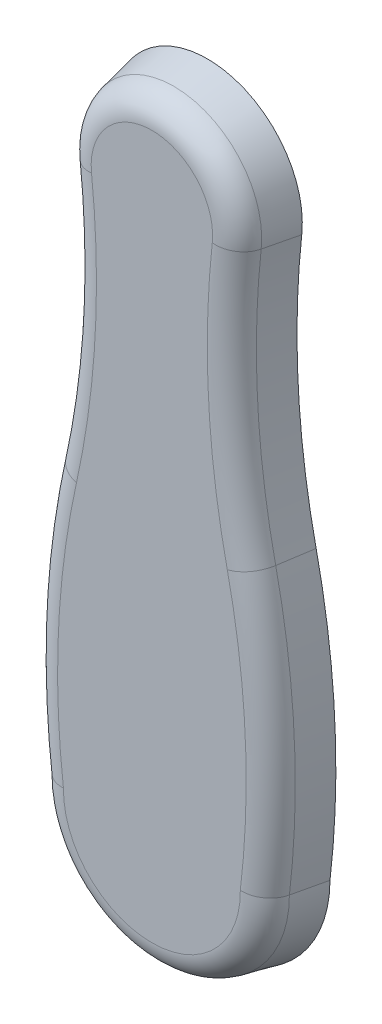
ISO-10303-21;
HEADER;
FILE_DESCRIPTION(('STEP AP214'),'2;1');
FILE_NAME('part.step','',(''),(''),'','','');
FILE_SCHEMA(('AUTOMOTIVE_DESIGN { 1 0 10303 214 1 1 1 1 }'));
ENDSEC;
DATA;
#1=APPLICATION_CONTEXT('core data for automotive mechanical design processes');
#2=APPLICATION_PROTOCOL_DEFINITION('international standard','automotive_design',2000,#1);
#3=PRODUCT_CONTEXT('',#1,'mechanical');
#4=PRODUCT('Part','Part','',(#3));
#5=PRODUCT_RELATED_PRODUCT_CATEGORY('part','',(#4));
#6=PRODUCT_DEFINITION_FORMATION('','',#4);
#7=PRODUCT_DEFINITION_CONTEXT('part definition',#1,'design');
#8=PRODUCT_DEFINITION('design','',#6,#7);
#9=PRODUCT_DEFINITION_SHAPE('','',#8);
#10=(LENGTH_UNIT() NAMED_UNIT(*) SI_UNIT(.MILLI.,.METRE.));
#11=(NAMED_UNIT(*) PLANE_ANGLE_UNIT() SI_UNIT($,.RADIAN.));
#12=(NAMED_UNIT(*) SI_UNIT($,.STERADIAN.) SOLID_ANGLE_UNIT());
#13=UNCERTAINTY_MEASURE_WITH_UNIT(LENGTH_MEASURE(1.E-05),#10,'distance_accuracy_value','');
#14=(GEOMETRIC_REPRESENTATION_CONTEXT(3) GLOBAL_UNCERTAINTY_ASSIGNED_CONTEXT((#13)) GLOBAL_UNIT_ASSIGNED_CONTEXT((#10,
#11,#12)) REPRESENTATION_CONTEXT('',''));
#15=CARTESIAN_POINT('',(0.,0.,0.));
#16=DIRECTION('',(0.,0.,1.));
#17=DIRECTION('',(1.,0.,0.));
#18=AXIS2_PLACEMENT_3D('',#15,#16,#17);
#19=CARTESIAN_POINT('',(-328.083559808091,164.486935028766,20.));
#20=DIRECTION('',(0.,0.,1.));
#21=DIRECTION('',(-1.,0.,0.));
#22=AXIS2_PLACEMENT_3D('',#19,#20,#21);
#23=CONICAL_SURFACE('',#22,300.,0.20943951023932);
#24=DIRECTION('',(-0.203051471258376,0.0446919589916192,-0.978147600733806));
#25=VECTOR('',#24,1.);
#26=CARTESIAN_POINT('',(-35.0964692894199,100.,20.));
#27=LINE('',#26,#25);
#28=CARTESIAN_POINT('',(-36.7407476828377,100.361908348036,12.0791169081776));
#29=VERTEX_POINT('',#28);
#30=CARTESIAN_POINT('',(-39.24822452771,100.913808078824,0.));
#31=VERTEX_POINT('',#30);
#32=EDGE_CURVE('E114',#29,#31,#27,.T.);
#33=ORIENTED_EDGE('',*,*,#32,.F.);
#34=CARTESIAN_POINT('',(-328.083559808091,164.486935028766,12.0791169081775));
#35=DIRECTION('',(0.,0.,-1.));
#36=DIRECTION('',(-1.,0.,0.));
#37=AXIS2_PLACEMENT_3D('',#34,#35,#36);
#38=CIRCLE('',#37,298.316364324612);
#39=CARTESIAN_POINT('',(-31.4996363031634,196.590354508288,12.0791169081776));
#40=VERTEX_POINT('',#39);
#41=EDGE_CURVE('E51',#29,#40,#38,.F.);
#42=ORIENTED_EDGE('',*,*,#41,.T.);
#43=DIRECTION('',(-0.206704265603666,-0.0223744890433036,-0.978147600733806));
#44=VECTOR('',#43,1.);
#45=CARTESIAN_POINT('',(-29.8257781643719,196.77153954807,20.));
#46=LINE('',#45,#44);
#47=CARTESIAN_POINT('',(-34.0522214015397,196.314052579303,0.));
#48=VERTEX_POINT('',#47);
#49=EDGE_CURVE('E140',#40,#48,#46,.T.);
#50=ORIENTED_EDGE('',*,*,#49,.T.);
#51=CARTESIAN_POINT('',(-328.083559808091,164.486935028766,0.));
#52=DIRECTION('',(0.,0.,-1.));
#53=DIRECTION('',(-1.,0.,0.));
#54=AXIS2_PLACEMENT_3D('',#51,#52,#53);
#55=CIRCLE('',#54,295.7488687666);
#56=EDGE_CURVE('E123',#48,#31,#55,.T.);
#57=ORIENTED_EDGE('',*,*,#56,.T.);
#58=EDGE_LOOP('',(#33,#42,#50,#57));
#59=FACE_BOUND('',#58,.T.);
#60=ADVANCED_FACE('F34',(#59),#23,.F.);
#61=CARTESIAN_POINT('',(257.890621229251,35.5130649712339,20.));
#62=DIRECTION('',(0.,0.,-1.));
#63=DIRECTION('',(1.,0.,0.));
#64=AXIS2_PLACEMENT_3D('',#61,#62,#63);
#65=CONICAL_SURFACE('',#64,300.,0.20943951023932);
#66=CARTESIAN_POINT('',(-40.,0.,20.));
#67=CARTESIAN_POINT('',(-40.708515301773,-0.0421104456059323,16.6666804994594));
#68=CARTESIAN_POINT('',(-41.4169712287903,-0.0846628276052535,13.3333540808833));
#69=CARTESIAN_POINT('',(-42.83376433192,-0.170651464306107,6.6666874142166));
#70=CARTESIAN_POINT('',(-43.5421015080326,-0.2140877190059,3.33334716612602));
#71=CARTESIAN_POINT('',(-44.2503793093897,-0.257965910097344,0.));
#72=B_SPLINE_CURVE_WITH_KNOTS('',3,(#66,#67,#68,#69,#70,#71),.UNSPECIFIED.,.F.,.F.,(4,2,4),(0.,
10.2241415124524,20.4482830047947),.UNSPECIFIED.);
#73=CARTESIAN_POINT('',(-41.6835135794539,-0.100889989374131,12.0791169081776));
#74=VERTEX_POINT('',#73);
#75=CARTESIAN_POINT('',(-44.2503793093897,-0.257965910096802,0.));
#76=VERTEX_POINT('',#75);
#77=EDGE_CURVE('E106',#74,#76,#72,.T.);
#78=ORIENTED_EDGE('',*,*,#77,.F.);
#79=CARTESIAN_POINT('',(257.890621229251,35.5130649712339,12.0791169081776));
#80=DIRECTION('',(0.,0.,1.));
#81=DIRECTION('',(1.,0.,0.));
#82=AXIS2_PLACEMENT_3D('',#79,#80,#81);
#83=CIRCLE('',#82,301.683635675388);
#84=EDGE_CURVE('E59',#74,#29,#83,.F.);
#85=ORIENTED_EDGE('',*,*,#84,.T.);
#86=ORIENTED_EDGE('',*,*,#32,.T.);
#87=CARTESIAN_POINT('',(257.890621229251,35.5130649712339,0.));
#88=DIRECTION('',(0.,0.,-1.));
#89=DIRECTION('',(-1.,0.,0.));
#90=AXIS2_PLACEMENT_3D('',#87,#88,#89);
#91=CIRCLE('',#90,304.251131233401);
#92=EDGE_CURVE('E118',#31,#76,#91,.F.);
#93=ORIENTED_EDGE('',*,*,#92,.T.);
#94=EDGE_LOOP('',(#78,#85,#86,#93));
#95=FACE_BOUND('',#94,.T.);
#96=ADVANCED_FACE('F119',(#95),#65,.T.);
#97=CARTESIAN_POINT('',(0.,0.,20.));
#98=DIRECTION('',(0.,0.,-1.));
#99=DIRECTION('',(1.,0.,0.));
#100=AXIS2_PLACEMENT_3D('',#97,#98,#99);
#101=CONICAL_SURFACE('',#100,40.,0.20943951023932);
#102=CARTESIAN_POINT('',(40.,0.,20.));
#103=CARTESIAN_POINT('',(40.7085153017731,-0.0421104456060641,16.6666804994594));
#104=CARTESIAN_POINT('',(41.4169712287903,-0.0846628276055089,13.3333540808833));
#105=CARTESIAN_POINT('',(42.83376433192,-0.17065146430651,6.66668741421661));
#106=CARTESIAN_POINT('',(43.5421015080326,-0.214087719006328,3.33334716612603));
#107=CARTESIAN_POINT('',(44.2503793093897,-0.257965910097746,0.));
#108=B_SPLINE_CURVE_WITH_KNOTS('',3,(#102,#103,#104,#105,#106,#107),.UNSPECIFIED.,.F.,.F.,(4,2,
4),(0.,10.2241415124524,20.4482830047947),.UNSPECIFIED.);
#109=CARTESIAN_POINT('',(41.683513579454,-0.100889989374964,12.0791169081776));
#110=VERTEX_POINT('',#109);
#111=CARTESIAN_POINT('',(44.2503793093897,-0.257965910097621,0.));
#112=VERTEX_POINT('',#111);
#113=EDGE_CURVE('E115',#110,#112,#108,.T.);
#114=ORIENTED_EDGE('',*,*,#113,.F.);
#115=CARTESIAN_POINT('',(0.,0.,12.0791169081776));
#116=DIRECTION('',(0.,0.,1.));
#117=DIRECTION('',(1.,0.,0.));
#118=AXIS2_PLACEMENT_3D('',#115,#116,#117);
#119=CIRCLE('',#118,41.683635675388);
#120=EDGE_CURVE('E43',#110,#74,#119,.F.);
#121=ORIENTED_EDGE('',*,*,#120,.T.);
#122=ORIENTED_EDGE('',*,*,#77,.T.);
#123=CARTESIAN_POINT('',(0.,0.,0.));
#124=DIRECTION('',(0.,0.,-1.));
#125=DIRECTION('',(-1.,0.,0.));
#126=AXIS2_PLACEMENT_3D('',#123,#124,#125);
#127=CIRCLE('',#126,44.2511312334004);
#128=EDGE_CURVE('E111',#76,#112,#127,.F.);
#129=ORIENTED_EDGE('',*,*,#128,.T.);
#130=EDGE_LOOP('',(#114,#121,#122,#129));
#131=FACE_BOUND('',#130,.T.);
#132=ADVANCED_FACE('F109',(#131),#101,.T.);
#133=CARTESIAN_POINT('',(-257.890621229251,35.513064971234,20.));
#134=DIRECTION('',(0.,0.,-1.));
#135=DIRECTION('',(-1.,0.,0.));
#136=AXIS2_PLACEMENT_3D('',#133,#134,#135);
#137=CONICAL_SURFACE('',#136,300.,0.20943951023932);
#138=DIRECTION('',(0.203051471258376,0.0446919589916192,-0.978147600733806));
#139=VECTOR('',#138,1.);
#140=CARTESIAN_POINT('',(35.0964692894198,100.,20.));
#141=LINE('',#140,#139);
#142=CARTESIAN_POINT('',(36.7407476828377,100.361908348036,12.0791169081776));
#143=VERTEX_POINT('',#142);
#144=CARTESIAN_POINT('',(39.24822452771,100.913808078824,0.));
#145=VERTEX_POINT('',#144);
#146=EDGE_CURVE('E133',#143,#145,#141,.T.);
#147=ORIENTED_EDGE('',*,*,#146,.F.);
#148=CARTESIAN_POINT('',(-257.890621229251,35.513064971234,12.0791169081777));
#149=DIRECTION('',(0.,0.,1.));
#150=DIRECTION('',(1.,0.,0.));
#151=AXIS2_PLACEMENT_3D('',#148,#149,#150);
#152=CIRCLE('',#151,301.683635675388);
#153=EDGE_CURVE('E156',#143,#110,#152,.F.);
#154=ORIENTED_EDGE('',*,*,#153,.T.);
#155=ORIENTED_EDGE('',*,*,#113,.T.);
#156=CARTESIAN_POINT('',(-257.890621229251,35.513064971234,0.));
#157=DIRECTION('',(0.,0.,-1.));
#158=DIRECTION('',(-1.,0.,0.));
#159=AXIS2_PLACEMENT_3D('',#156,#157,#158);
#160=CIRCLE('',#159,304.2511312334);
#161=EDGE_CURVE('E128',#112,#145,#160,.F.);
#162=ORIENTED_EDGE('',*,*,#161,.T.);
#163=EDGE_LOOP('',(#147,#154,#155,#162));
#164=FACE_BOUND('',#163,.T.);
#165=ADVANCED_FACE('F219',(#164),#137,.T.);
#166=CARTESIAN_POINT('',(328.08355980809,164.486935028766,20.));
#167=DIRECTION('',(0.,0.,1.));
#168=DIRECTION('',(1.,0.,0.));
#169=AXIS2_PLACEMENT_3D('',#166,#167,#168);
#170=CONICAL_SURFACE('',#169,300.,0.20943951023932);
#171=DIRECTION('',(0.206704265603666,-0.0223744890433035,-0.978147600733806));
#172=VECTOR('',#171,1.);
#173=CARTESIAN_POINT('',(29.8257781643718,196.77153954807,20.));
#174=LINE('',#173,#172);
#175=CARTESIAN_POINT('',(31.4996363031633,196.590354508288,12.0791169081776));
#176=VERTEX_POINT('',#175);
#177=CARTESIAN_POINT('',(34.0522214015396,196.314052579303,0.));
#178=VERTEX_POINT('',#177);
#179=EDGE_CURVE('E226',#176,#178,#174,.T.);
#180=ORIENTED_EDGE('',*,*,#179,.F.);
#181=CARTESIAN_POINT('',(328.08355980809,164.486935028766,12.0791169081776));
#182=DIRECTION('',(0.,0.,-1.));
#183=DIRECTION('',(-1.,0.,0.));
#184=AXIS2_PLACEMENT_3D('',#181,#182,#183);
#185=CIRCLE('',#184,298.316364324612);
#186=EDGE_CURVE('E159',#176,#143,#185,.F.);
#187=ORIENTED_EDGE('',*,*,#186,.T.);
#188=ORIENTED_EDGE('',*,*,#146,.T.);
#189=CARTESIAN_POINT('',(328.08355980809,164.486935028766,0.));
#190=DIRECTION('',(0.,0.,-1.));
#191=DIRECTION('',(-1.,0.,0.));
#192=AXIS2_PLACEMENT_3D('',#189,#190,#191);
#193=CIRCLE('',#192,295.748868766599);
#194=EDGE_CURVE('E130',#145,#178,#193,.T.);
#195=ORIENTED_EDGE('',*,*,#194,.T.);
#196=EDGE_LOOP('',(#180,#187,#188,#195));
#197=FACE_BOUND('',#196,.T.);
#198=ADVANCED_FACE('F216',(#197),#170,.F.);
#199=CARTESIAN_POINT('',(0.,200.,20.));
#200=DIRECTION('',(0.,0.,-1.));
#201=DIRECTION('',(1.,0.,0.));
#202=AXIS2_PLACEMENT_3D('',#199,#200,#201);
#203=CONICAL_SURFACE('',#202,29.9999999999999,0.20943951023932);
#204=ORIENTED_EDGE('',*,*,#49,.F.);
#205=CARTESIAN_POINT('',(0.,200.,12.0791169081776));
#206=DIRECTION('',(0.,0.,1.));
#207=DIRECTION('',(1.,0.,0.));
#208=AXIS2_PLACEMENT_3D('',#205,#206,#207);
#209=CIRCLE('',#208,31.6836356753879);
#210=EDGE_CURVE('E11',#40,#176,#209,.F.);
#211=ORIENTED_EDGE('',*,*,#210,.T.);
#212=ORIENTED_EDGE('',*,*,#179,.T.);
#213=CARTESIAN_POINT('',(0.,200.,0.));
#214=DIRECTION('',(0.,0.,-1.));
#215=DIRECTION('',(-1.,0.,0.));
#216=AXIS2_PLACEMENT_3D('',#213,#214,#215);
#217=CIRCLE('',#216,34.2511312334004);
#218=EDGE_CURVE('E137',#178,#48,#217,.F.);
#219=ORIENTED_EDGE('',*,*,#218,.T.);
#220=EDGE_LOOP('',(#204,#211,#212,#219));
#221=FACE_BOUND('',#220,.T.);
#222=ADVANCED_FACE('F213',(#221),#203,.T.);
#223=CARTESIAN_POINT('',(-35.0964692894199,100.,20.));
#224=DIRECTION('',(0.,0.,-1.));
#225=DIRECTION('',(-1.,0.,0.));
#226=AXIS2_PLACEMENT_3D('',#223,#224,#225);
#227=PLANE('',#226);
#228=CARTESIAN_POINT('',(257.890621229251,35.5130649712339,20.));
#229=DIRECTION('',(0.,0.,-1.));
#230=DIRECTION('',(-1.,0.,0.));
#231=AXIS2_PLACEMENT_3D('',#228,#229,#230);
#232=CIRCLE('',#231,291.90215966805);
#233=CARTESIAN_POINT('',(-27.1879270282772,98.2593169888008,20.));
#234=VERTEX_POINT('',#233);
#235=CARTESIAN_POINT('',(-31.8988833933146,0.457197709391691,20.));
#236=VERTEX_POINT('',#235);
#237=EDGE_CURVE('E147',#234,#236,#232,.F.);
#238=ORIENTED_EDGE('',*,*,#237,.T.);
#239=CARTESIAN_POINT('',(0.,0.,20.));
#240=DIRECTION('',(0.,0.,-1.));
#241=DIRECTION('',(-1.,0.,0.));
#242=AXIS2_PLACEMENT_3D('',#239,#240,#241);
#243=CIRCLE('',#242,31.9021596680499);
#244=CARTESIAN_POINT('',(31.8988833933146,0.457197709391413,20.));
#245=VERTEX_POINT('',#244);
#246=EDGE_CURVE('E154',#236,#245,#243,.F.);
#247=ORIENTED_EDGE('',*,*,#246,.T.);
#248=CARTESIAN_POINT('',(-257.890621229251,35.513064971234,20.));
#249=DIRECTION('',(0.,0.,-1.));
#250=DIRECTION('',(-1.,0.,0.));
#251=AXIS2_PLACEMENT_3D('',#248,#249,#250);
#252=CIRCLE('',#251,291.90215966805);
#253=CARTESIAN_POINT('',(27.1879270282772,98.2593169888008,20.));
#254=VERTEX_POINT('',#253);
#255=EDGE_CURVE('E151',#245,#254,#252,.F.);
#256=ORIENTED_EDGE('',*,*,#255,.T.);
#257=CARTESIAN_POINT('',(328.08355980809,164.486935028766,20.));
#258=DIRECTION('',(0.,0.,-1.));
#259=DIRECTION('',(-1.,0.,0.));
#260=AXIS2_PLACEMENT_3D('',#257,#258,#259);
#261=CIRCLE('',#260,308.09784033195);
#262=CARTESIAN_POINT('',(21.7749651859969,197.642991456661,20.));
#263=VERTEX_POINT('',#262);
#264=EDGE_CURVE('E149',#254,#263,#261,.T.);
#265=ORIENTED_EDGE('',*,*,#264,.T.);
#266=CARTESIAN_POINT('',(0.,200.,20.));
#267=DIRECTION('',(0.,0.,-1.));
#268=DIRECTION('',(-1.,0.,0.));
#269=AXIS2_PLACEMENT_3D('',#266,#267,#268);
#270=CIRCLE('',#269,21.9021596680499);
#271=CARTESIAN_POINT('',(-21.7749651859969,197.642991456661,20.));
#272=VERTEX_POINT('',#271);
#273=EDGE_CURVE('E143',#263,#272,#270,.F.);
#274=ORIENTED_EDGE('',*,*,#273,.T.);
#275=CARTESIAN_POINT('',(-328.083559808091,164.486935028766,20.));
#276=DIRECTION('',(0.,0.,-1.));
#277=DIRECTION('',(-1.,0.,0.));
#278=AXIS2_PLACEMENT_3D('',#275,#276,#277);
#279=CIRCLE('',#278,308.09784033195);
#280=EDGE_CURVE('E145',#272,#234,#279,.T.);
#281=ORIENTED_EDGE('',*,*,#280,.T.);
#282=EDGE_LOOP('',(#238,#247,#256,#265,#274,#281));
#283=FACE_BOUND('',#282,.T.);
#284=ADVANCED_FACE('F215',(#283),#227,.F.);
#285=CARTESIAN_POINT('',(-35.0964692894199,100.,0.));
#286=DIRECTION('',(0.,0.,-1.));
#287=DIRECTION('',(-1.,0.,0.));
#288=AXIS2_PLACEMENT_3D('',#285,#286,#287);
#289=PLANE('',#288);
#290=ORIENTED_EDGE('',*,*,#56,.F.);
#291=ORIENTED_EDGE('',*,*,#218,.F.);
#292=ORIENTED_EDGE('',*,*,#194,.F.);
#293=ORIENTED_EDGE('',*,*,#161,.F.);
#294=ORIENTED_EDGE('',*,*,#128,.F.);
#295=ORIENTED_EDGE('',*,*,#92,.F.);
#296=EDGE_LOOP('',(#290,#291,#292,#293,#294,#295));
#297=FACE_BOUND('',#296,.T.);
#298=ADVANCED_FACE('F125',(#297),#289,.T.);
#299=CARTESIAN_POINT('',(-328.083559808091,164.486935028766,9.99999999999997));
#300=DIRECTION('',(0.,0.,-1.));
#301=DIRECTION('',(-1.,0.,0.));
#302=AXIS2_PLACEMENT_3D('',#299,#300,#301);
#303=TOROIDAL_SURFACE('',#302,308.09784033195,10.);
#304=CARTESIAN_POINT('',(-21.774965185997,197.642991456661,10.));
#305=DIRECTION('',(-0.107615348397678,0.994192605479063,0.));
#306=DIRECTION('',(-0.994192605479062,-0.107615348397678,0.));
#307=AXIS2_PLACEMENT_3D('',#304,#305,#306);
#308=CIRCLE('',#307,10.);
#309=EDGE_CURVE('E194',#40,#272,#308,.T.);
#310=ORIENTED_EDGE('',*,*,#309,.F.);
#311=ORIENTED_EDGE('',*,*,#41,.F.);
#312=CARTESIAN_POINT('',(-27.1879270282772,98.2593169888008,10.));
#313=DIRECTION('',(-0.214956450095886,-0.976623635062236,0.));
#314=DIRECTION('',(0.976623635062236,-0.214956450095887,0.));
#315=AXIS2_PLACEMENT_3D('',#312,#313,#314);
#316=CIRCLE('',#315,10.);
#317=EDGE_CURVE('E38',#234,#29,#316,.T.);
#318=ORIENTED_EDGE('',*,*,#317,.F.);
#319=ORIENTED_EDGE('',*,*,#280,.F.);
#320=EDGE_LOOP('',(#310,#311,#318,#319));
#321=FACE_BOUND('',#320,.T.);
#322=ADVANCED_FACE('F36',(#321),#303,.T.);
#323=CARTESIAN_POINT('',(257.890621229251,35.5130649712339,10.));
#324=DIRECTION('',(0.,0.,-1.));
#325=DIRECTION('',(-1.,0.,0.));
#326=AXIS2_PLACEMENT_3D('',#323,#324,#325);
#327=TOROIDAL_SURFACE('',#326,291.90215966805,10.);
#328=ORIENTED_EDGE('',*,*,#317,.T.);
#329=ORIENTED_EDGE('',*,*,#84,.F.);
#330=CARTESIAN_POINT('',(-41.683513579454,-0.100889989374131,12.0791169081776));
#331=CARTESIAN_POINT('',(-41.6251206091379,-0.097360791916975,12.3540199172253));
#332=CARTESIAN_POINT('',(-41.5550848937644,-0.0931299627722813,12.6264345778957));
#333=CARTESIAN_POINT('',(-41.3923628755233,-0.0833142968796569,13.1643726897803));
#334=CARTESIAN_POINT('',(-41.2996777811654,-0.0777295323741782,13.4298965078352));
#335=CARTESIAN_POINT('',(-41.0923535141221,-0.0652589530137017,13.95199698654));
#336=CARTESIAN_POINT('',(-40.9777287718133,-0.0583739933763215,14.208579397826));
#337=CARTESIAN_POINT('',(-40.727316788823,-0.0433647868856561,14.7111589886496));
#338=CARTESIAN_POINT('',(-40.5915297773937,-0.0352405534575279,14.9571562828195));
#339=CARTESIAN_POINT('',(-40.2996914031639,-0.0178229655766584,15.4369377422194));
#340=CARTESIAN_POINT('',(-40.1436304843985,-0.00852905987195522,15.6707160747953));
#341=CARTESIAN_POINT('',(-39.8124064846584,0.0111400313638195,16.1242835491182));
#342=CARTESIAN_POINT('',(-39.6372429808786,0.0215152408275905,16.3440723810593));
#343=CARTESIAN_POINT('',(-39.2691367399132,0.0432482268125987,16.7680201062348));
#344=CARTESIAN_POINT('',(-39.076200793288,0.0546056279537924,16.9721849150139));
#345=CARTESIAN_POINT('',(-38.6738684036437,0.0782036528958776,17.3635361024063));
#346=CARTESIAN_POINT('',(-38.4644720543573,0.090444271667308,17.5507225776887));
#347=CARTESIAN_POINT('',(-38.0305438458026,0.115708423773827,17.9069347489981));
#348=CARTESIAN_POINT('',(-37.806000747347,0.12873253768496,18.0759467125038));
#349=CARTESIAN_POINT('',(-37.3435155587681,0.155439311507283,18.3944605145299));
#350=CARTESIAN_POINT('',(-37.1055734270077,0.169121973464872,18.5439622924182));
#351=CARTESIAN_POINT('',(-36.6177515191799,0.197038158656499,18.8225367317079));
#352=CARTESIAN_POINT('',(-36.3678608079069,0.211272184139605,18.9515901944793));
#353=CARTESIAN_POINT('',(-35.8581312757408,0.2401542289805,19.1881910777858));
#354=CARTESIAN_POINT('',(-35.5982927332588,0.254802236749114,19.295739099673));
#355=CARTESIAN_POINT('',(-35.06376673058,0.284764091116702,19.491043313827));
#356=CARTESIAN_POINT('',(-34.7888695846462,0.300085391822795,19.5782249074861));
#357=CARTESIAN_POINT('',(-34.2325921841539,0.330894602866579,19.7285439356334));
#358=CARTESIAN_POINT('',(-33.9512121040305,0.346382508715492,19.7916820162569));
#359=CARTESIAN_POINT('',(-33.384800382303,0.377349502826036,19.8933289702941));
#360=CARTESIAN_POINT('',(-33.0997798814625,0.392828512867816,19.9319002357568));
#361=CARTESIAN_POINT('',(-32.527610396747,0.423679577915781,19.9843711881532));
#362=CARTESIAN_POINT('',(-32.2404631346295,0.439051703282362,19.9982890201981));
#363=CARTESIAN_POINT('',(-31.9352137106838,0.455268958851495,19.9999506485247));
#364=CARTESIAN_POINT('',(-31.9170482688122,0.456233583459184,20.0000000647118));
#365=CARTESIAN_POINT('',(-31.8988833933145,0.457197709391136,20.));
#366=B_SPLINE_CURVE_WITH_KNOTS('',3,(#330,#331,#332,#333,#334,#335,#336,#337,#338,#339,#340,
#341,#342,#343,#344,#345,#346,#347,#348,#349,#350,#351,#352,#353,#354,#355,#356,#357,#358,#359,
#360,#361,#362,#363,#364,#365),.UNSPECIFIED.,.F.,.F.,(4,2,2,2,2,2,2,2,2,2,2,2,2,2,2,2,2,4),(0.,
0.842916861738996,1.68578875753235,2.52810816403635,3.3704184462716,4.21312719591216,
5.05585460134667,5.89826133951436,6.74066328099628,7.583697327455,8.42673399376286,
9.27055754403448,10.1143574953464,10.979673472497,11.8449661938711,12.7080524855198,
13.5705032748493,13.6250762706922),.UNSPECIFIED.);
#367=EDGE_CURVE('E188',#236,#74,#366,.F.);
#368=ORIENTED_EDGE('',*,*,#367,.F.);
#369=ORIENTED_EDGE('',*,*,#237,.F.);
#370=EDGE_LOOP('',(#328,#329,#368,#369));
#371=FACE_BOUND('',#370,.T.);
#372=ADVANCED_FACE('F195',(#371),#327,.T.);
#373=CARTESIAN_POINT('',(0.,200.,10.));
#374=DIRECTION('',(0.,0.,-1.));
#375=DIRECTION('',(-1.,0.,0.));
#376=AXIS2_PLACEMENT_3D('',#373,#374,#375);
#377=TOROIDAL_SURFACE('',#376,21.9021596680499,10.);
#378=ORIENTED_EDGE('',*,*,#309,.T.);
#379=ORIENTED_EDGE('',*,*,#273,.F.);
#380=CARTESIAN_POINT('',(21.7749651859969,197.642991456661,10.));
#381=DIRECTION('',(-0.107615348397677,-0.994192605479063,0.));
#382=DIRECTION('',(0.994192605479062,-0.107615348397678,0.));
#383=AXIS2_PLACEMENT_3D('',#380,#381,#382);
#384=CIRCLE('',#383,10.);
#385=EDGE_CURVE('E174',#176,#263,#384,.T.);
#386=ORIENTED_EDGE('',*,*,#385,.F.);
#387=ORIENTED_EDGE('',*,*,#210,.F.);
#388=EDGE_LOOP('',(#378,#379,#386,#387));
#389=FACE_BOUND('',#388,.T.);
#390=ADVANCED_FACE('F184',(#389),#377,.T.);
#391=CARTESIAN_POINT('',(0.,0.,10.));
#392=DIRECTION('',(0.,0.,-1.));
#393=DIRECTION('',(-1.,0.,0.));
#394=AXIS2_PLACEMENT_3D('',#391,#392,#393);
#395=TOROIDAL_SURFACE('',#394,31.9021596680499,10.);
#396=ORIENTED_EDGE('',*,*,#367,.T.);
#397=ORIENTED_EDGE('',*,*,#120,.F.);
#398=CARTESIAN_POINT('',(41.683513579454,-0.100889989374936,12.0791169081776));
#399=CARTESIAN_POINT('',(41.6251206091379,-0.0973607919170418,12.3540199172253));
#400=CARTESIAN_POINT('',(41.5550848937644,-0.0931299627722271,12.6264345778957));
#401=CARTESIAN_POINT('',(41.3923628755233,-0.0833142968797465,13.1643726897803));
#402=CARTESIAN_POINT('',(41.2996777811654,-0.0777295323745325,13.4298965078352));
#403=CARTESIAN_POINT('',(41.0923535141221,-0.0652589530141228,13.95199698654));
#404=CARTESIAN_POINT('',(40.9777287718133,-0.058373993376545,14.2085793978261));
#405=CARTESIAN_POINT('',(40.7273167888229,-0.0433647868857131,14.7111589886496));
#406=CARTESIAN_POINT('',(40.5915297773936,-0.0352405534576158,14.9571562828195));
#407=CARTESIAN_POINT('',(40.2996914031639,-0.0178229655766538,15.4369377422194));
#408=CARTESIAN_POINT('',(40.1436304843985,-0.00852905987182718,15.6707160747953));
#409=CARTESIAN_POINT('',(39.8124064846584,0.0111400313643378,16.1242835491181));
#410=CARTESIAN_POINT('',(39.6372429808786,0.0215152408283756,16.3440723810593));
#411=CARTESIAN_POINT('',(39.2691367399133,0.0432482268134214,16.7680201062348));
#412=CARTESIAN_POINT('',(39.076200793288,0.0546056279543862,16.9721849150139));
#413=CARTESIAN_POINT('',(38.6738684036437,0.0782036528960686,17.3635361024063));
#414=CARTESIAN_POINT('',(38.4644720543574,0.0904442716673253,17.5507225776887));
#415=CARTESIAN_POINT('',(38.0305438458027,0.11570842377431,17.9069347489981));
#416=CARTESIAN_POINT('',(37.8060007473471,0.128732537686083,18.0759467125037));
#417=CARTESIAN_POINT('',(37.3435155587682,0.15543931150886,18.3944605145298));
#418=CARTESIAN_POINT('',(37.1055734270078,0.169121973466262,18.5439622924182));
#419=CARTESIAN_POINT('',(36.6177515191799,0.197038158658236,18.8225367317078));
#420=CARTESIAN_POINT('',(36.367860807907,0.211272184141875,18.9515901944792));
#421=CARTESIAN_POINT('',(35.8581312757408,0.240154228981715,19.1881910777858));
#422=CARTESIAN_POINT('',(35.5982927332588,0.25480223674874,19.2957390996731));
#423=CARTESIAN_POINT('',(35.06376673058,0.284764091116917,19.491043313827));
#424=CARTESIAN_POINT('',(34.7888695846463,0.300085391825286,19.578224907486));
#425=CARTESIAN_POINT('',(34.2325921841541,0.330894602870419,19.7285439356334));
#426=CARTESIAN_POINT('',(33.9512121040307,0.346382508718404,19.7916820162568));
#427=CARTESIAN_POINT('',(33.3848003823034,0.377349502832664,19.893328970294));
#428=CARTESIAN_POINT('',(33.0997798814631,0.392828512879075,19.9319002357567));
#429=CARTESIAN_POINT('',(32.5276103967475,0.423679577925002,19.9843711881532));
#430=CARTESIAN_POINT('',(32.2404631346296,0.439051703284923,19.9982890201981));
#431=CARTESIAN_POINT('',(31.9352137106839,0.455268958851496,19.9999506485247));
#432=CARTESIAN_POINT('',(31.9170482688122,0.45623358345905,20.0000000647118));
#433=CARTESIAN_POINT('',(31.8988833933146,0.457197709390886,20.));
#434=B_SPLINE_CURVE_WITH_KNOTS('',3,(#398,#399,#400,#401,#402,#403,#404,#405,#406,#407,#408,
#409,#410,#411,#412,#413,#414,#415,#416,#417,#418,#419,#420,#421,#422,#423,#424,#425,#426,#427,
#428,#429,#430,#431,#432,#433),.UNSPECIFIED.,.F.,.F.,(4,2,2,2,2,2,2,2,2,2,2,2,2,2,2,2,2,4),(0.,
0.842916861738989,1.68578875753234,2.52810816403635,3.37041844627161,4.21312719591215,
5.05585460134666,5.89826133951433,6.74066328099623,7.58369732745496,8.42673399376282,
9.27055754403446,10.1143574953463,10.9796734724969,11.844966193871,12.7080524855198,
13.5705032748492,13.6250762706922),.UNSPECIFIED.);
#435=EDGE_CURVE('E166',#245,#110,#434,.F.);
#436=ORIENTED_EDGE('',*,*,#435,.F.);
#437=ORIENTED_EDGE('',*,*,#246,.F.);
#438=EDGE_LOOP('',(#396,#397,#436,#437));
#439=FACE_BOUND('',#438,.T.);
#440=ADVANCED_FACE('F179',(#439),#395,.T.);
#441=CARTESIAN_POINT('',(328.08355980809,164.486935028766,10.0000000000001));
#442=DIRECTION('',(0.,0.,-1.));
#443=DIRECTION('',(-1.,0.,0.));
#444=AXIS2_PLACEMENT_3D('',#441,#442,#443);
#445=TOROIDAL_SURFACE('',#444,308.09784033195,10.);
#446=ORIENTED_EDGE('',*,*,#385,.T.);
#447=ORIENTED_EDGE('',*,*,#264,.F.);
#448=CARTESIAN_POINT('',(27.1879270282771,98.2593169888008,10.));
#449=DIRECTION('',(0.214956450095887,-0.976623635062236,0.));
#450=DIRECTION('',(0.976623635062235,0.214956450095887,0.));
#451=AXIS2_PLACEMENT_3D('',#448,#449,#450);
#452=CIRCLE('',#451,10.);
#453=EDGE_CURVE('E164',#143,#254,#452,.T.);
#454=ORIENTED_EDGE('',*,*,#453,.F.);
#455=ORIENTED_EDGE('',*,*,#186,.F.);
#456=EDGE_LOOP('',(#446,#447,#454,#455));
#457=FACE_BOUND('',#456,.T.);
#458=ADVANCED_FACE('F183',(#457),#445,.T.);
#459=CARTESIAN_POINT('',(-257.890621229251,35.513064971234,9.99999999999997));
#460=DIRECTION('',(0.,0.,-1.));
#461=DIRECTION('',(-1.,0.,0.));
#462=AXIS2_PLACEMENT_3D('',#459,#460,#461);
#463=TOROIDAL_SURFACE('',#462,291.90215966805,10.);
#464=ORIENTED_EDGE('',*,*,#435,.T.);
#465=ORIENTED_EDGE('',*,*,#153,.F.);
#466=ORIENTED_EDGE('',*,*,#453,.T.);
#467=ORIENTED_EDGE('',*,*,#255,.F.);
#468=EDGE_LOOP('',(#464,#465,#466,#467));
#469=FACE_BOUND('',#468,.T.);
#470=ADVANCED_FACE('F176',(#469),#463,.T.);
#471=CLOSED_SHELL('',(#60,#96,#132,#165,#198,#222,#284,#298,#322,#372,#390,#440,#458,#470));
#472=MANIFOLD_SOLID_BREP('B2',#471);
#473=ADVANCED_BREP_SHAPE_REPRESENTATION('',(#18,#472),#14);
#474=SHAPE_DEFINITION_REPRESENTATION(#9,#473);
ENDSEC;
END-ISO-10303-21;
